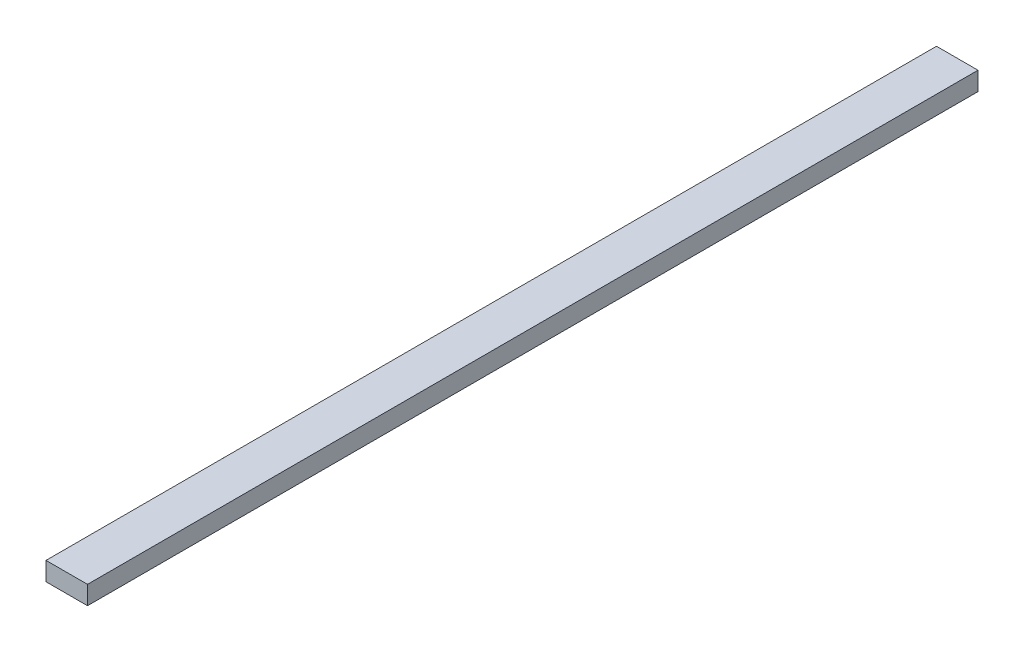
ISO-10303-21;
HEADER;
FILE_DESCRIPTION(('STEP AP214'),'2;1');
FILE_NAME('part.step','',(''),(''),'','','');
FILE_SCHEMA(('AUTOMOTIVE_DESIGN { 1 0 10303 214 1 1 1 1 }'));
ENDSEC;
DATA;
#1=APPLICATION_CONTEXT('core data for automotive mechanical design processes');
#2=APPLICATION_PROTOCOL_DEFINITION('international standard','automotive_design',2000,#1);
#3=PRODUCT_CONTEXT('',#1,'mechanical');
#4=PRODUCT('Part','Part','',(#3));
#5=PRODUCT_RELATED_PRODUCT_CATEGORY('part','',(#4));
#6=PRODUCT_DEFINITION_FORMATION('','',#4);
#7=PRODUCT_DEFINITION_CONTEXT('part definition',#1,'design');
#8=PRODUCT_DEFINITION('design','',#6,#7);
#9=PRODUCT_DEFINITION_SHAPE('','',#8);
#10=(LENGTH_UNIT() NAMED_UNIT(*) SI_UNIT(.MILLI.,.METRE.));
#11=(NAMED_UNIT(*) PLANE_ANGLE_UNIT() SI_UNIT($,.RADIAN.));
#12=(NAMED_UNIT(*) SI_UNIT($,.STERADIAN.) SOLID_ANGLE_UNIT());
#13=UNCERTAINTY_MEASURE_WITH_UNIT(LENGTH_MEASURE(1.E-05),#10,'distance_accuracy_value','');
#14=(GEOMETRIC_REPRESENTATION_CONTEXT(3) GLOBAL_UNCERTAINTY_ASSIGNED_CONTEXT((#13)) GLOBAL_UNIT_ASSIGNED_CONTEXT((#10,
#11,#12)) REPRESENTATION_CONTEXT('',''));
#15=CARTESIAN_POINT('',(0.,0.,0.));
#16=DIRECTION('',(0.,0.,1.));
#17=DIRECTION('',(1.,0.,0.));
#18=AXIS2_PLACEMENT_3D('',#15,#16,#17);
#19=CARTESIAN_POINT('',(18.6436,8.3312,400.));
#20=DIRECTION('',(0.,-1.,0.));
#21=DIRECTION('',(0.,0.,-1.));
#22=AXIS2_PLACEMENT_3D('',#19,#20,#21);
#23=PLANE('',#22);
#24=DIRECTION('',(-1.,0.,0.));
#25=VECTOR('',#24,1.);
#26=CARTESIAN_POINT('',(18.6436,8.3312,-400.));
#27=LINE('',#26,#25);
#28=CARTESIAN_POINT('',(18.6436,8.3312,-400.));
#29=VERTEX_POINT('',#28);
#30=CARTESIAN_POINT('',(-18.6436,8.3312,-400.));
#31=VERTEX_POINT('',#30);
#32=EDGE_CURVE('E102',#29,#31,#27,.T.);
#33=ORIENTED_EDGE('',*,*,#32,.T.);
#34=DIRECTION('',(0.,0.,-1.));
#35=VECTOR('',#34,1.);
#36=CARTESIAN_POINT('',(-18.6436,8.3312,400.));
#37=LINE('',#36,#35);
#38=CARTESIAN_POINT('',(-18.6436,8.3312,400.));
#39=VERTEX_POINT('',#38);
#40=EDGE_CURVE('E11',#39,#31,#37,.T.);
#41=ORIENTED_EDGE('',*,*,#40,.F.);
#42=DIRECTION('',(-1.,0.,0.));
#43=VECTOR('',#42,1.);
#44=CARTESIAN_POINT('',(18.6436,8.3312,400.));
#45=LINE('',#44,#43);
#46=CARTESIAN_POINT('',(18.6436,8.3312,400.));
#47=VERTEX_POINT('',#46);
#48=EDGE_CURVE('E95',#47,#39,#45,.T.);
#49=ORIENTED_EDGE('',*,*,#48,.F.);
#50=DIRECTION('',(0.,0.,-1.));
#51=VECTOR('',#50,1.);
#52=CARTESIAN_POINT('',(18.6436,8.3312,400.));
#53=LINE('',#52,#51);
#54=EDGE_CURVE('E99',#47,#29,#53,.T.);
#55=ORIENTED_EDGE('',*,*,#54,.T.);
#56=EDGE_LOOP('',(#33,#41,#49,#55));
#57=FACE_BOUND('',#56,.T.);
#58=ADVANCED_FACE('F41',(#57),#23,.F.);
#59=CARTESIAN_POINT('',(-18.6436,-8.3312,400.));
#60=DIRECTION('',(1.,0.,0.));
#61=DIRECTION('',(0.,0.,-1.));
#62=AXIS2_PLACEMENT_3D('',#59,#60,#61);
#63=PLANE('',#62);
#64=DIRECTION('',(0.,-1.,0.));
#65=VECTOR('',#64,1.);
#66=CARTESIAN_POINT('',(-18.6436,-8.3312,-400.));
#67=LINE('',#66,#65);
#68=CARTESIAN_POINT('',(-18.6436,-8.3312,-400.));
#69=VERTEX_POINT('',#68);
#70=EDGE_CURVE('E96',#31,#69,#67,.T.);
#71=ORIENTED_EDGE('',*,*,#70,.T.);
#72=DIRECTION('',(0.,0.,-1.));
#73=VECTOR('',#72,1.);
#74=CARTESIAN_POINT('',(-18.6436,-8.3312,400.));
#75=LINE('',#74,#73);
#76=CARTESIAN_POINT('',(-18.6436,-8.3312,400.));
#77=VERTEX_POINT('',#76);
#78=EDGE_CURVE('E47',#77,#69,#75,.T.);
#79=ORIENTED_EDGE('',*,*,#78,.F.);
#80=DIRECTION('',(0.,-1.,0.));
#81=VECTOR('',#80,1.);
#82=CARTESIAN_POINT('',(-18.6436,-8.3312,400.));
#83=LINE('',#82,#81);
#84=EDGE_CURVE('E87',#39,#77,#83,.T.);
#85=ORIENTED_EDGE('',*,*,#84,.F.);
#86=ORIENTED_EDGE('',*,*,#40,.T.);
#87=EDGE_LOOP('',(#71,#79,#85,#86));
#88=FACE_BOUND('',#87,.T.);
#89=ADVANCED_FACE('F92',(#88),#63,.F.);
#90=CARTESIAN_POINT('',(18.6436,-8.3312,400.));
#91=DIRECTION('',(0.,1.,0.));
#92=DIRECTION('',(0.,0.,1.));
#93=AXIS2_PLACEMENT_3D('',#90,#91,#92);
#94=PLANE('',#93);
#95=DIRECTION('',(1.,0.,0.));
#96=VECTOR('',#95,1.);
#97=CARTESIAN_POINT('',(18.6436,-8.3312,-400.));
#98=LINE('',#97,#96);
#99=CARTESIAN_POINT('',(18.6436,-8.3312,-400.));
#100=VERTEX_POINT('',#99);
#101=EDGE_CURVE('E74',#69,#100,#98,.T.);
#102=ORIENTED_EDGE('',*,*,#101,.T.);
#103=DIRECTION('',(0.,0.,-1.));
#104=VECTOR('',#103,1.);
#105=CARTESIAN_POINT('',(18.6436,-8.3312,400.));
#106=LINE('',#105,#104);
#107=CARTESIAN_POINT('',(18.6436,-8.3312,400.));
#108=VERTEX_POINT('',#107);
#109=EDGE_CURVE('E100',#108,#100,#106,.T.);
#110=ORIENTED_EDGE('',*,*,#109,.F.);
#111=DIRECTION('',(1.,0.,0.));
#112=VECTOR('',#111,1.);
#113=CARTESIAN_POINT('',(18.6436,-8.3312,400.));
#114=LINE('',#113,#112);
#115=EDGE_CURVE('E89',#77,#108,#114,.T.);
#116=ORIENTED_EDGE('',*,*,#115,.F.);
#117=ORIENTED_EDGE('',*,*,#78,.T.);
#118=EDGE_LOOP('',(#102,#110,#116,#117));
#119=FACE_BOUND('',#118,.T.);
#120=ADVANCED_FACE('F98',(#119),#94,.F.);
#121=CARTESIAN_POINT('',(18.6436,-8.3312,400.));
#122=DIRECTION('',(-1.,0.,0.));
#123=DIRECTION('',(0.,0.,1.));
#124=AXIS2_PLACEMENT_3D('',#121,#122,#123);
#125=PLANE('',#124);
#126=DIRECTION('',(0.,1.,0.));
#127=VECTOR('',#126,1.);
#128=CARTESIAN_POINT('',(18.6436,-8.3312,-400.));
#129=LINE('',#128,#127);
#130=EDGE_CURVE('E78',#100,#29,#129,.T.);
#131=ORIENTED_EDGE('',*,*,#130,.T.);
#132=ORIENTED_EDGE('',*,*,#54,.F.);
#133=DIRECTION('',(0.,1.,0.));
#134=VECTOR('',#133,1.);
#135=CARTESIAN_POINT('',(18.6436,-8.3312,400.));
#136=LINE('',#135,#134);
#137=EDGE_CURVE('E60',#108,#47,#136,.T.);
#138=ORIENTED_EDGE('',*,*,#137,.F.);
#139=ORIENTED_EDGE('',*,*,#109,.T.);
#140=EDGE_LOOP('',(#131,#132,#138,#139));
#141=FACE_BOUND('',#140,.T.);
#142=ADVANCED_FACE('F112',(#141),#125,.F.);
#143=CARTESIAN_POINT('',(0.,0.,400.));
#144=DIRECTION('',(0.,0.,-1.));
#145=DIRECTION('',(-1.,0.,0.));
#146=AXIS2_PLACEMENT_3D('',#143,#144,#145);
#147=PLANE('',#146);
#148=ORIENTED_EDGE('',*,*,#48,.T.);
#149=ORIENTED_EDGE('',*,*,#84,.T.);
#150=ORIENTED_EDGE('',*,*,#115,.T.);
#151=ORIENTED_EDGE('',*,*,#137,.T.);
#152=EDGE_LOOP('',(#148,#149,#150,#151));
#153=FACE_BOUND('',#152,.T.);
#154=ADVANCED_FACE('F86',(#153),#147,.F.);
#155=CARTESIAN_POINT('',(0.,0.,-400.));
#156=DIRECTION('',(0.,0.,-1.));
#157=DIRECTION('',(-1.,0.,0.));
#158=AXIS2_PLACEMENT_3D('',#155,#156,#157);
#159=PLANE('',#158);
#160=ORIENTED_EDGE('',*,*,#32,.F.);
#161=ORIENTED_EDGE('',*,*,#130,.F.);
#162=ORIENTED_EDGE('',*,*,#101,.F.);
#163=ORIENTED_EDGE('',*,*,#70,.F.);
#164=EDGE_LOOP('',(#160,#161,#162,#163));
#165=FACE_BOUND('',#164,.T.);
#166=ADVANCED_FACE('F111',(#165),#159,.T.);
#167=CLOSED_SHELL('',(#58,#89,#120,#142,#154,#166));
#168=MANIFOLD_SOLID_BREP('B2',#167);
#169=ADVANCED_BREP_SHAPE_REPRESENTATION('',(#18,#168),#14);
#170=SHAPE_DEFINITION_REPRESENTATION(#9,#169);
ENDSEC;
END-ISO-10303-21;
